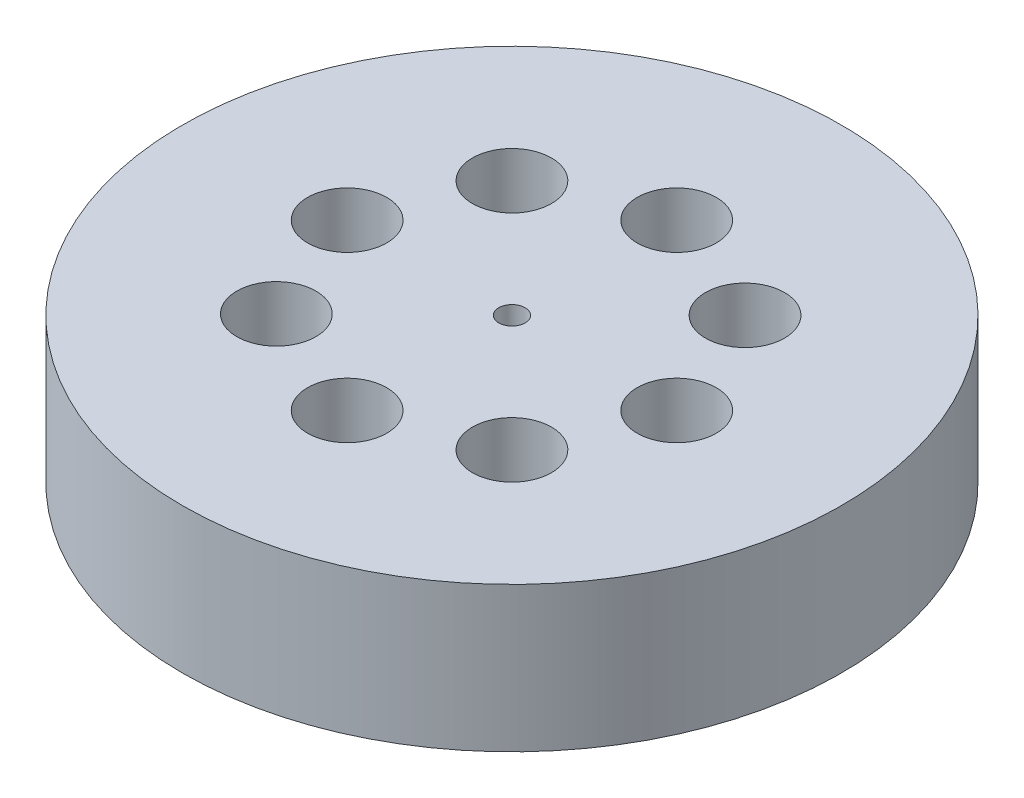
ISO-10303-21;
HEADER;
FILE_DESCRIPTION(('STEP AP214'),'2;1');
FILE_NAME('part.step','',(''),(''),'','','');
FILE_SCHEMA(('AUTOMOTIVE_DESIGN { 1 0 10303 214 1 1 1 1 }'));
ENDSEC;
DATA;
#1=APPLICATION_CONTEXT('core data for automotive mechanical design processes');
#2=APPLICATION_PROTOCOL_DEFINITION('international standard','automotive_design',2000,#1);
#3=PRODUCT_CONTEXT('',#1,'mechanical');
#4=PRODUCT('Part','Part','',(#3));
#5=PRODUCT_RELATED_PRODUCT_CATEGORY('part','',(#4));
#6=PRODUCT_DEFINITION_FORMATION('','',#4);
#7=PRODUCT_DEFINITION_CONTEXT('part definition',#1,'design');
#8=PRODUCT_DEFINITION('design','',#6,#7);
#9=PRODUCT_DEFINITION_SHAPE('','',#8);
#10=(LENGTH_UNIT() NAMED_UNIT(*) SI_UNIT(.MILLI.,.METRE.));
#11=(NAMED_UNIT(*) PLANE_ANGLE_UNIT() SI_UNIT($,.RADIAN.));
#12=(NAMED_UNIT(*) SI_UNIT($,.STERADIAN.) SOLID_ANGLE_UNIT());
#13=UNCERTAINTY_MEASURE_WITH_UNIT(LENGTH_MEASURE(1.E-05),#10,'distance_accuracy_value','');
#14=(GEOMETRIC_REPRESENTATION_CONTEXT(3) GLOBAL_UNCERTAINTY_ASSIGNED_CONTEXT((#13)) GLOBAL_UNIT_ASSIGNED_CONTEXT((#10,
#11,#12)) REPRESENTATION_CONTEXT('',''));
#15=CARTESIAN_POINT('',(0.,0.,0.));
#16=DIRECTION('',(0.,0.,1.));
#17=DIRECTION('',(1.,0.,0.));
#18=AXIS2_PLACEMENT_3D('',#15,#16,#17);
#19=CARTESIAN_POINT('',(0.,22.,0.));
#20=DIRECTION('',(0.,-1.,0.));
#21=DIRECTION('',(0.,0.,-1.));
#22=AXIS2_PLACEMENT_3D('',#19,#20,#21);
#23=CYLINDRICAL_SURFACE('',#22,50.);
#24=CARTESIAN_POINT('',(0.,22.,0.));
#25=DIRECTION('',(0.,1.,0.));
#26=DIRECTION('',(0.,0.,1.));
#27=AXIS2_PLACEMENT_3D('',#24,#25,#26);
#28=CIRCLE('',#27,50.);
#29=CARTESIAN_POINT('',(0.,22.,50.));
#30=VERTEX_POINT('',#29);
#31=EDGE_CURVE('E10',#30,#30,#28,.T.);
#32=ORIENTED_EDGE('',*,*,#31,.F.);
#33=EDGE_LOOP('',(#32));
#34=FACE_BOUND('',#33,.T.);
#35=CARTESIAN_POINT('',(0.,0.,0.));
#36=DIRECTION('',(0.,1.,0.));
#37=DIRECTION('',(0.,0.,1.));
#38=AXIS2_PLACEMENT_3D('',#35,#36,#37);
#39=CIRCLE('',#38,50.);
#40=CARTESIAN_POINT('',(0.,0.,50.));
#41=VERTEX_POINT('',#40);
#42=EDGE_CURVE('E36',#41,#41,#39,.T.);
#43=ORIENTED_EDGE('',*,*,#42,.T.);
#44=EDGE_LOOP('',(#43));
#45=FACE_BOUND('',#44,.T.);
#46=ADVANCED_FACE('F33',(#34,#45),#23,.T.);
#47=CARTESIAN_POINT('',(0.,22.,0.));
#48=DIRECTION('',(0.,1.,0.));
#49=DIRECTION('',(0.,0.,1.));
#50=AXIS2_PLACEMENT_3D('',#47,#48,#49);
#51=PLANE('',#50);
#52=CARTESIAN_POINT('',(0.,22.,0.));
#53=DIRECTION('',(0.,-1.,0.));
#54=DIRECTION('',(0.,0.,-1.));
#55=AXIS2_PLACEMENT_3D('',#52,#53,#54);
#56=CIRCLE('',#55,2.);
#57=CARTESIAN_POINT('',(0.,22.,-2.));
#58=VERTEX_POINT('',#57);
#59=EDGE_CURVE('E96',#58,#58,#56,.T.);
#60=ORIENTED_EDGE('',*,*,#59,.T.);
#61=EDGE_LOOP('',(#60));
#62=FACE_BOUND('',#61,.T.);
#63=CARTESIAN_POINT('',(0.,22.,-25.));
#64=DIRECTION('',(0.,-1.,0.));
#65=DIRECTION('',(0.,0.,-1.));
#66=AXIS2_PLACEMENT_3D('',#63,#64,#65);
#67=CIRCLE('',#66,6.);
#68=CARTESIAN_POINT('',(0.,22.,-31.));
#69=VERTEX_POINT('',#68);
#70=EDGE_CURVE('E84',#69,#69,#67,.T.);
#71=ORIENTED_EDGE('',*,*,#70,.T.);
#72=EDGE_LOOP('',(#71));
#73=FACE_BOUND('',#72,.T.);
#74=CARTESIAN_POINT('',(25.,22.,0.));
#75=DIRECTION('',(0.,-1.,0.));
#76=DIRECTION('',(0.,0.,-1.));
#77=AXIS2_PLACEMENT_3D('',#74,#75,#76);
#78=CIRCLE('',#77,6.);
#79=CARTESIAN_POINT('',(25.,22.,-6.));
#80=VERTEX_POINT('',#79);
#81=EDGE_CURVE('E78',#80,#80,#78,.T.);
#82=ORIENTED_EDGE('',*,*,#81,.T.);
#83=EDGE_LOOP('',(#82));
#84=FACE_BOUND('',#83,.T.);
#85=CARTESIAN_POINT('',(-25.,22.,0.));
#86=DIRECTION('',(0.,-1.,0.));
#87=DIRECTION('',(0.,0.,-1.));
#88=AXIS2_PLACEMENT_3D('',#85,#86,#87);
#89=CIRCLE('',#88,6.);
#90=CARTESIAN_POINT('',(-25.,22.,-6.));
#91=VERTEX_POINT('',#90);
#92=EDGE_CURVE('E72',#91,#91,#89,.T.);
#93=ORIENTED_EDGE('',*,*,#92,.T.);
#94=EDGE_LOOP('',(#93));
#95=FACE_BOUND('',#94,.T.);
#96=CARTESIAN_POINT('',(0.,22.,25.));
#97=DIRECTION('',(0.,-1.,0.));
#98=DIRECTION('',(0.,0.,-1.));
#99=AXIS2_PLACEMENT_3D('',#96,#97,#98);
#100=CIRCLE('',#99,6.);
#101=CARTESIAN_POINT('',(0.,22.,19.));
#102=VERTEX_POINT('',#101);
#103=EDGE_CURVE('E66',#102,#102,#100,.T.);
#104=ORIENTED_EDGE('',*,*,#103,.T.);
#105=EDGE_LOOP('',(#104));
#106=FACE_BOUND('',#105,.T.);
#107=CARTESIAN_POINT('',(17.68,22.,17.68));
#108=DIRECTION('',(0.,-1.,0.));
#109=DIRECTION('',(0.,0.,-1.));
#110=AXIS2_PLACEMENT_3D('',#107,#108,#109);
#111=CIRCLE('',#110,6.);
#112=CARTESIAN_POINT('',(17.68,22.,11.68));
#113=VERTEX_POINT('',#112);
#114=EDGE_CURVE('E60',#113,#113,#111,.T.);
#115=ORIENTED_EDGE('',*,*,#114,.T.);
#116=EDGE_LOOP('',(#115));
#117=FACE_BOUND('',#116,.T.);
#118=CARTESIAN_POINT('',(-17.68,22.,-17.68));
#119=DIRECTION('',(0.,-1.,0.));
#120=DIRECTION('',(0.,0.,-1.));
#121=AXIS2_PLACEMENT_3D('',#118,#119,#120);
#122=CIRCLE('',#121,6.);
#123=CARTESIAN_POINT('',(-17.68,22.,-23.68));
#124=VERTEX_POINT('',#123);
#125=EDGE_CURVE('E54',#124,#124,#122,.T.);
#126=ORIENTED_EDGE('',*,*,#125,.T.);
#127=EDGE_LOOP('',(#126));
#128=FACE_BOUND('',#127,.T.);
#129=CARTESIAN_POINT('',(-18.0581267493541,22.,17.68));
#130=DIRECTION('',(0.,-1.,0.));
#131=DIRECTION('',(0.,0.,-1.));
#132=AXIS2_PLACEMENT_3D('',#129,#130,#131);
#133=CIRCLE('',#132,6.);
#134=CARTESIAN_POINT('',(-18.0581267493541,22.,11.68));
#135=VERTEX_POINT('',#134);
#136=EDGE_CURVE('E48',#135,#135,#133,.T.);
#137=ORIENTED_EDGE('',*,*,#136,.T.);
#138=EDGE_LOOP('',(#137));
#139=FACE_BOUND('',#138,.T.);
#140=CARTESIAN_POINT('',(17.68,22.,-17.68));
#141=DIRECTION('',(0.,-1.,0.));
#142=DIRECTION('',(0.,0.,-1.));
#143=AXIS2_PLACEMENT_3D('',#140,#141,#142);
#144=CIRCLE('',#143,6.);
#145=CARTESIAN_POINT('',(17.68,22.,-23.68));
#146=VERTEX_POINT('',#145);
#147=EDGE_CURVE('E43',#146,#146,#144,.T.);
#148=ORIENTED_EDGE('',*,*,#147,.T.);
#149=EDGE_LOOP('',(#148));
#150=FACE_BOUND('',#149,.T.);
#151=ORIENTED_EDGE('',*,*,#31,.T.);
#152=EDGE_LOOP('',(#151));
#153=FACE_BOUND('',#152,.T.);
#154=ADVANCED_FACE('F105',(#62,#73,#84,#95,#106,#117,#128,#139,#150,#153),#51,.T.);
#155=CARTESIAN_POINT('',(0.,0.,0.));
#156=DIRECTION('',(0.,1.,0.));
#157=DIRECTION('',(0.,0.,1.));
#158=AXIS2_PLACEMENT_3D('',#155,#156,#157);
#159=PLANE('',#158);
#160=CARTESIAN_POINT('',(0.,0.,0.));
#161=DIRECTION('',(0.,-1.,0.));
#162=DIRECTION('',(0.,0.,-1.));
#163=AXIS2_PLACEMENT_3D('',#160,#161,#162);
#164=CIRCLE('',#163,10.);
#165=CARTESIAN_POINT('',(0.,0.,-10.));
#166=VERTEX_POINT('',#165);
#167=EDGE_CURVE('E93',#166,#166,#164,.T.);
#168=ORIENTED_EDGE('',*,*,#167,.F.);
#169=EDGE_LOOP('',(#168));
#170=FACE_BOUND('',#169,.T.);
#171=CARTESIAN_POINT('',(0.,0.,-25.));
#172=DIRECTION('',(0.,-1.,0.));
#173=DIRECTION('',(0.,0.,-1.));
#174=AXIS2_PLACEMENT_3D('',#171,#172,#173);
#175=CIRCLE('',#174,6.);
#176=CARTESIAN_POINT('',(0.,0.,-31.));
#177=VERTEX_POINT('',#176);
#178=EDGE_CURVE('E87',#177,#177,#175,.T.);
#179=ORIENTED_EDGE('',*,*,#178,.F.);
#180=EDGE_LOOP('',(#179));
#181=FACE_BOUND('',#180,.T.);
#182=CARTESIAN_POINT('',(25.,0.,0.));
#183=DIRECTION('',(0.,-1.,0.));
#184=DIRECTION('',(0.,0.,-1.));
#185=AXIS2_PLACEMENT_3D('',#182,#183,#184);
#186=CIRCLE('',#185,6.);
#187=CARTESIAN_POINT('',(25.,0.,-6.));
#188=VERTEX_POINT('',#187);
#189=EDGE_CURVE('E81',#188,#188,#186,.T.);
#190=ORIENTED_EDGE('',*,*,#189,.F.);
#191=EDGE_LOOP('',(#190));
#192=FACE_BOUND('',#191,.T.);
#193=CARTESIAN_POINT('',(-25.,0.,0.));
#194=DIRECTION('',(0.,-1.,0.));
#195=DIRECTION('',(0.,0.,-1.));
#196=AXIS2_PLACEMENT_3D('',#193,#194,#195);
#197=CIRCLE('',#196,6.);
#198=CARTESIAN_POINT('',(-25.,0.,-6.));
#199=VERTEX_POINT('',#198);
#200=EDGE_CURVE('E75',#199,#199,#197,.T.);
#201=ORIENTED_EDGE('',*,*,#200,.F.);
#202=EDGE_LOOP('',(#201));
#203=FACE_BOUND('',#202,.T.);
#204=CARTESIAN_POINT('',(0.,0.,25.));
#205=DIRECTION('',(0.,-1.,0.));
#206=DIRECTION('',(0.,0.,-1.));
#207=AXIS2_PLACEMENT_3D('',#204,#205,#206);
#208=CIRCLE('',#207,6.);
#209=CARTESIAN_POINT('',(0.,0.,19.));
#210=VERTEX_POINT('',#209);
#211=EDGE_CURVE('E69',#210,#210,#208,.T.);
#212=ORIENTED_EDGE('',*,*,#211,.F.);
#213=EDGE_LOOP('',(#212));
#214=FACE_BOUND('',#213,.T.);
#215=CARTESIAN_POINT('',(17.68,0.,17.68));
#216=DIRECTION('',(0.,-1.,0.));
#217=DIRECTION('',(0.,0.,-1.));
#218=AXIS2_PLACEMENT_3D('',#215,#216,#217);
#219=CIRCLE('',#218,6.);
#220=CARTESIAN_POINT('',(17.68,0.,11.68));
#221=VERTEX_POINT('',#220);
#222=EDGE_CURVE('E63',#221,#221,#219,.T.);
#223=ORIENTED_EDGE('',*,*,#222,.F.);
#224=EDGE_LOOP('',(#223));
#225=FACE_BOUND('',#224,.T.);
#226=CARTESIAN_POINT('',(-17.68,0.,-17.68));
#227=DIRECTION('',(0.,-1.,0.));
#228=DIRECTION('',(0.,0.,-1.));
#229=AXIS2_PLACEMENT_3D('',#226,#227,#228);
#230=CIRCLE('',#229,6.);
#231=CARTESIAN_POINT('',(-17.68,0.,-23.68));
#232=VERTEX_POINT('',#231);
#233=EDGE_CURVE('E57',#232,#232,#230,.T.);
#234=ORIENTED_EDGE('',*,*,#233,.F.);
#235=EDGE_LOOP('',(#234));
#236=FACE_BOUND('',#235,.T.);
#237=CARTESIAN_POINT('',(-18.0581267493541,0.,17.68));
#238=DIRECTION('',(0.,-1.,0.));
#239=DIRECTION('',(0.,0.,-1.));
#240=AXIS2_PLACEMENT_3D('',#237,#238,#239);
#241=CIRCLE('',#240,6.);
#242=CARTESIAN_POINT('',(-18.0581267493541,0.,11.68));
#243=VERTEX_POINT('',#242);
#244=EDGE_CURVE('E51',#243,#243,#241,.T.);
#245=ORIENTED_EDGE('',*,*,#244,.F.);
#246=EDGE_LOOP('',(#245));
#247=FACE_BOUND('',#246,.T.);
#248=CARTESIAN_POINT('',(17.68,0.,-17.68));
#249=DIRECTION('',(0.,-1.,0.));
#250=DIRECTION('',(0.,0.,-1.));
#251=AXIS2_PLACEMENT_3D('',#248,#249,#250);
#252=CIRCLE('',#251,6.);
#253=CARTESIAN_POINT('',(17.68,0.,-23.68));
#254=VERTEX_POINT('',#253);
#255=EDGE_CURVE('E45',#254,#254,#252,.T.);
#256=ORIENTED_EDGE('',*,*,#255,.F.);
#257=EDGE_LOOP('',(#256));
#258=FACE_BOUND('',#257,.T.);
#259=ORIENTED_EDGE('',*,*,#42,.F.);
#260=EDGE_LOOP('',(#259));
#261=FACE_BOUND('',#260,.T.);
#262=ADVANCED_FACE('F127',(#170,#181,#192,#203,#214,#225,#236,#247,#258,#261),#159,.F.);
#263=CARTESIAN_POINT('',(17.68,22.,-17.68));
#264=DIRECTION('',(0.,-1.,0.));
#265=DIRECTION('',(0.,0.,-1.));
#266=AXIS2_PLACEMENT_3D('',#263,#264,#265);
#267=CYLINDRICAL_SURFACE('',#266,6.);
#268=ORIENTED_EDGE('',*,*,#147,.F.);
#269=EDGE_LOOP('',(#268));
#270=FACE_BOUND('',#269,.T.);
#271=ORIENTED_EDGE('',*,*,#255,.T.);
#272=EDGE_LOOP('',(#271));
#273=FACE_BOUND('',#272,.T.);
#274=ADVANCED_FACE('F130',(#270,#273),#267,.F.);
#275=CARTESIAN_POINT('',(-18.0581267493541,22.,17.68));
#276=DIRECTION('',(0.,-1.,0.));
#277=DIRECTION('',(0.,0.,-1.));
#278=AXIS2_PLACEMENT_3D('',#275,#276,#277);
#279=CYLINDRICAL_SURFACE('',#278,6.);
#280=ORIENTED_EDGE('',*,*,#136,.F.);
#281=EDGE_LOOP('',(#280));
#282=FACE_BOUND('',#281,.T.);
#283=ORIENTED_EDGE('',*,*,#244,.T.);
#284=EDGE_LOOP('',(#283));
#285=FACE_BOUND('',#284,.T.);
#286=ADVANCED_FACE('F160',(#282,#285),#279,.F.);
#287=CARTESIAN_POINT('',(-17.68,22.,-17.68));
#288=DIRECTION('',(0.,-1.,0.));
#289=DIRECTION('',(0.,0.,-1.));
#290=AXIS2_PLACEMENT_3D('',#287,#288,#289);
#291=CYLINDRICAL_SURFACE('',#290,6.);
#292=ORIENTED_EDGE('',*,*,#125,.F.);
#293=EDGE_LOOP('',(#292));
#294=FACE_BOUND('',#293,.T.);
#295=ORIENTED_EDGE('',*,*,#233,.T.);
#296=EDGE_LOOP('',(#295));
#297=FACE_BOUND('',#296,.T.);
#298=ADVANCED_FACE('F164',(#294,#297),#291,.F.);
#299=CARTESIAN_POINT('',(17.68,22.,17.68));
#300=DIRECTION('',(0.,-1.,0.));
#301=DIRECTION('',(0.,0.,-1.));
#302=AXIS2_PLACEMENT_3D('',#299,#300,#301);
#303=CYLINDRICAL_SURFACE('',#302,6.);
#304=ORIENTED_EDGE('',*,*,#114,.F.);
#305=EDGE_LOOP('',(#304));
#306=FACE_BOUND('',#305,.T.);
#307=ORIENTED_EDGE('',*,*,#222,.T.);
#308=EDGE_LOOP('',(#307));
#309=FACE_BOUND('',#308,.T.);
#310=ADVANCED_FACE('F168',(#306,#309),#303,.F.);
#311=CARTESIAN_POINT('',(0.,22.,25.));
#312=DIRECTION('',(0.,-1.,0.));
#313=DIRECTION('',(0.,0.,-1.));
#314=AXIS2_PLACEMENT_3D('',#311,#312,#313);
#315=CYLINDRICAL_SURFACE('',#314,6.);
#316=ORIENTED_EDGE('',*,*,#103,.F.);
#317=EDGE_LOOP('',(#316));
#318=FACE_BOUND('',#317,.T.);
#319=ORIENTED_EDGE('',*,*,#211,.T.);
#320=EDGE_LOOP('',(#319));
#321=FACE_BOUND('',#320,.T.);
#322=ADVANCED_FACE('F172',(#318,#321),#315,.F.);
#323=CARTESIAN_POINT('',(-25.,22.,0.));
#324=DIRECTION('',(0.,-1.,0.));
#325=DIRECTION('',(0.,0.,-1.));
#326=AXIS2_PLACEMENT_3D('',#323,#324,#325);
#327=CYLINDRICAL_SURFACE('',#326,6.);
#328=ORIENTED_EDGE('',*,*,#92,.F.);
#329=EDGE_LOOP('',(#328));
#330=FACE_BOUND('',#329,.T.);
#331=ORIENTED_EDGE('',*,*,#200,.T.);
#332=EDGE_LOOP('',(#331));
#333=FACE_BOUND('',#332,.T.);
#334=ADVANCED_FACE('F176',(#330,#333),#327,.F.);
#335=CARTESIAN_POINT('',(25.,22.,0.));
#336=DIRECTION('',(0.,-1.,0.));
#337=DIRECTION('',(0.,0.,-1.));
#338=AXIS2_PLACEMENT_3D('',#335,#336,#337);
#339=CYLINDRICAL_SURFACE('',#338,6.);
#340=ORIENTED_EDGE('',*,*,#81,.F.);
#341=EDGE_LOOP('',(#340));
#342=FACE_BOUND('',#341,.T.);
#343=ORIENTED_EDGE('',*,*,#189,.T.);
#344=EDGE_LOOP('',(#343));
#345=FACE_BOUND('',#344,.T.);
#346=ADVANCED_FACE('F180',(#342,#345),#339,.F.);
#347=CARTESIAN_POINT('',(0.,22.,-25.));
#348=DIRECTION('',(0.,-1.,0.));
#349=DIRECTION('',(0.,0.,-1.));
#350=AXIS2_PLACEMENT_3D('',#347,#348,#349);
#351=CYLINDRICAL_SURFACE('',#350,6.);
#352=ORIENTED_EDGE('',*,*,#70,.F.);
#353=EDGE_LOOP('',(#352));
#354=FACE_BOUND('',#353,.T.);
#355=ORIENTED_EDGE('',*,*,#178,.T.);
#356=EDGE_LOOP('',(#355));
#357=FACE_BOUND('',#356,.T.);
#358=ADVANCED_FACE('F123',(#354,#357),#351,.F.);
#359=CARTESIAN_POINT('',(0.,18.,0.));
#360=DIRECTION('',(0.,-1.,0.));
#361=DIRECTION('',(0.,0.,-1.));
#362=AXIS2_PLACEMENT_3D('',#359,#360,#361);
#363=CYLINDRICAL_SURFACE('',#362,10.);
#364=CARTESIAN_POINT('',(0.,18.,0.));
#365=DIRECTION('',(0.,-1.,0.));
#366=DIRECTION('',(0.,0.,-1.));
#367=AXIS2_PLACEMENT_3D('',#364,#365,#366);
#368=CIRCLE('',#367,10.);
#369=CARTESIAN_POINT('',(0.,18.,-10.));
#370=VERTEX_POINT('',#369);
#371=EDGE_CURVE('E90',#370,#370,#368,.T.);
#372=ORIENTED_EDGE('',*,*,#371,.F.);
#373=EDGE_LOOP('',(#372));
#374=FACE_BOUND('',#373,.T.);
#375=ORIENTED_EDGE('',*,*,#167,.T.);
#376=EDGE_LOOP('',(#375));
#377=FACE_BOUND('',#376,.T.);
#378=ADVANCED_FACE('F117',(#374,#377),#363,.F.);
#379=CARTESIAN_POINT('',(0.,18.,0.));
#380=DIRECTION('',(0.,-1.,0.));
#381=DIRECTION('',(0.,0.,-1.));
#382=AXIS2_PLACEMENT_3D('',#379,#380,#381);
#383=PLANE('',#382);
#384=CARTESIAN_POINT('',(0.,18.,0.));
#385=DIRECTION('',(0.,-1.,0.));
#386=DIRECTION('',(0.,0.,-1.));
#387=AXIS2_PLACEMENT_3D('',#384,#385,#386);
#388=CIRCLE('',#387,2.);
#389=CARTESIAN_POINT('',(0.,18.,-2.));
#390=VERTEX_POINT('',#389);
#391=EDGE_CURVE('E99',#390,#390,#388,.T.);
#392=ORIENTED_EDGE('',*,*,#391,.F.);
#393=EDGE_LOOP('',(#392));
#394=FACE_BOUND('',#393,.T.);
#395=ORIENTED_EDGE('',*,*,#371,.T.);
#396=EDGE_LOOP('',(#395));
#397=FACE_BOUND('',#396,.T.);
#398=ADVANCED_FACE('F111',(#394,#397),#383,.T.);
#399=CARTESIAN_POINT('',(0.,22.,0.));
#400=DIRECTION('',(0.,-1.,0.));
#401=DIRECTION('',(0.,0.,-1.));
#402=AXIS2_PLACEMENT_3D('',#399,#400,#401);
#403=CYLINDRICAL_SURFACE('',#402,2.);
#404=ORIENTED_EDGE('',*,*,#59,.F.);
#405=EDGE_LOOP('',(#404));
#406=FACE_BOUND('',#405,.T.);
#407=ORIENTED_EDGE('',*,*,#391,.T.);
#408=EDGE_LOOP('',(#407));
#409=FACE_BOUND('',#408,.T.);
#410=ADVANCED_FACE('F108',(#406,#409),#403,.F.);
#411=CLOSED_SHELL('',(#46,#154,#262,#274,#286,#298,#310,#322,#334,#346,#358,#378,#398,#410));
#412=MANIFOLD_SOLID_BREP('B2',#411);
#413=ADVANCED_BREP_SHAPE_REPRESENTATION('',(#18,#412),#14);
#414=SHAPE_DEFINITION_REPRESENTATION(#9,#413);
ENDSEC;
END-ISO-10303-21;
